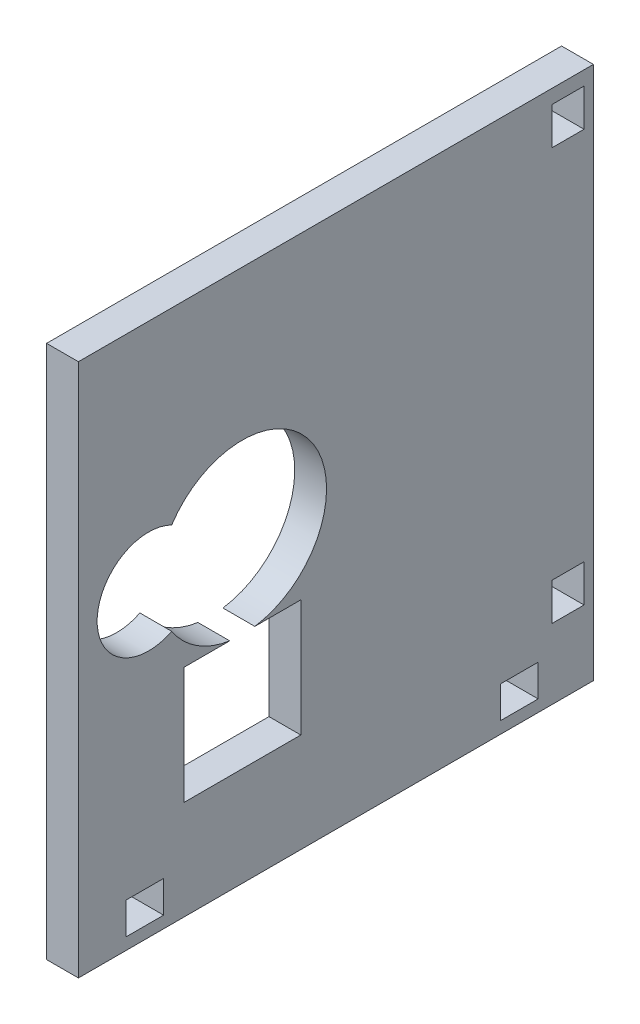
ISO-10303-21;
HEADER;
FILE_DESCRIPTION(('STEP AP214'),'2;1');
FILE_NAME('part.step','',(''),(''),'','','');
FILE_SCHEMA(('AUTOMOTIVE_DESIGN { 1 0 10303 214 1 1 1 1 }'));
ENDSEC;
DATA;
#1=APPLICATION_CONTEXT('core data for automotive mechanical design processes');
#2=APPLICATION_PROTOCOL_DEFINITION('international standard','automotive_design',2000,#1);
#3=PRODUCT_CONTEXT('',#1,'mechanical');
#4=PRODUCT('Part','Part','',(#3));
#5=PRODUCT_RELATED_PRODUCT_CATEGORY('part','',(#4));
#6=PRODUCT_DEFINITION_FORMATION('','',#4);
#7=PRODUCT_DEFINITION_CONTEXT('part definition',#1,'design');
#8=PRODUCT_DEFINITION('design','',#6,#7);
#9=PRODUCT_DEFINITION_SHAPE('','',#8);
#10=(LENGTH_UNIT() NAMED_UNIT(*) SI_UNIT(.MILLI.,.METRE.));
#11=(NAMED_UNIT(*) PLANE_ANGLE_UNIT() SI_UNIT($,.RADIAN.));
#12=(NAMED_UNIT(*) SI_UNIT($,.STERADIAN.) SOLID_ANGLE_UNIT());
#13=UNCERTAINTY_MEASURE_WITH_UNIT(LENGTH_MEASURE(1.E-05),#10,'distance_accuracy_value','');
#14=(GEOMETRIC_REPRESENTATION_CONTEXT(3) GLOBAL_UNCERTAINTY_ASSIGNED_CONTEXT((#13)) GLOBAL_UNIT_ASSIGNED_CONTEXT((#10,
#11,#12)) REPRESENTATION_CONTEXT('',''));
#15=CARTESIAN_POINT('',(0.,0.,0.));
#16=DIRECTION('',(0.,0.,1.));
#17=DIRECTION('',(1.,0.,0.));
#18=AXIS2_PLACEMENT_3D('',#15,#16,#17);
#19=CARTESIAN_POINT('',(1.7272,11.7348,-12.065));
#20=DIRECTION('',(0.,-1.,0.));
#21=DIRECTION('',(0.,0.,-1.));
#22=AXIS2_PLACEMENT_3D('',#19,#20,#21);
#23=PLANE('',#22);
#24=DIRECTION('',(1.,0.,0.));
#25=VECTOR('',#24,1.);
#26=CARTESIAN_POINT('',(-15.4139288385537,11.7348,-8.2103423214584));
#27=LINE('',#26,#25);
#28=CARTESIAN_POINT('',(0.,11.7348,-8.2103423214584));
#29=VERTEX_POINT('',#28);
#30=CARTESIAN_POINT('',(1.7272,11.7348,-8.2103423214584));
#31=VERTEX_POINT('',#30);
#32=EDGE_CURVE('E222',#29,#31,#27,.T.);
#33=ORIENTED_EDGE('',*,*,#32,.T.);
#34=DIRECTION('',(0.,0.,1.));
#35=VECTOR('',#34,1.);
#36=CARTESIAN_POINT('',(1.7272,11.7348,-12.065));
#37=LINE('',#36,#35);
#38=CARTESIAN_POINT('',(1.7272,11.7348,-5.715));
#39=VERTEX_POINT('',#38);
#40=EDGE_CURVE('E376',#31,#39,#37,.T.);
#41=ORIENTED_EDGE('',*,*,#40,.T.);
#42=DIRECTION('',(-1.,0.,0.));
#43=VECTOR('',#42,1.);
#44=CARTESIAN_POINT('',(1.7272,11.7348,-5.715));
#45=LINE('',#44,#43);
#46=CARTESIAN_POINT('',(0.,11.7348,-5.715));
#47=VERTEX_POINT('',#46);
#48=EDGE_CURVE('E401',#39,#47,#45,.T.);
#49=ORIENTED_EDGE('',*,*,#48,.T.);
#50=DIRECTION('',(0.,0.,1.));
#51=VECTOR('',#50,1.);
#52=CARTESIAN_POINT('',(0.,11.7348,-12.065));
#53=LINE('',#52,#51);
#54=EDGE_CURVE('E389',#29,#47,#53,.T.);
#55=ORIENTED_EDGE('',*,*,#54,.F.);
#56=EDGE_LOOP('',(#33,#41,#49,#55));
#57=FACE_BOUND('',#56,.T.);
#58=ADVANCED_FACE('F30',(#57),#23,.T.);
#59=CARTESIAN_POINT('',(1.7272,28.956,0.));
#60=DIRECTION('',(-1.,0.,0.));
#61=DIRECTION('',(0.,0.,1.));
#62=AXIS2_PLACEMENT_3D('',#59,#60,#61);
#63=PLANE('',#62);
#64=DIRECTION('',(0.,-1.,0.));
#65=VECTOR('',#64,1.);
#66=CARTESIAN_POINT('',(1.7272,2.36855,-22.9107999999998));
#67=LINE('',#66,#65);
#68=CARTESIAN_POINT('',(1.7272,2.36855,-22.9107999999998));
#69=VERTEX_POINT('',#68);
#70=CARTESIAN_POINT('',(1.7272,0.641349999999995,-22.9107999999998));
#71=VERTEX_POINT('',#70);
#72=EDGE_CURVE('E252',#69,#71,#67,.T.);
#73=ORIENTED_EDGE('',*,*,#72,.F.);
#74=DIRECTION('',(0.,0.,1.));
#75=VECTOR('',#74,1.);
#76=CARTESIAN_POINT('',(1.7272,2.36855,-24.9427999999998));
#77=LINE('',#76,#75);
#78=CARTESIAN_POINT('',(1.7272,2.36855,-24.9427999999998));
#79=VERTEX_POINT('',#78);
#80=EDGE_CURVE('E255',#79,#69,#77,.T.);
#81=ORIENTED_EDGE('',*,*,#80,.F.);
#82=DIRECTION('',(0.,1.,0.));
#83=VECTOR('',#82,1.);
#84=CARTESIAN_POINT('',(1.7272,0.641349999999995,-24.9427999999998));
#85=LINE('',#84,#83);
#86=CARTESIAN_POINT('',(1.7272,0.641349999999995,-24.9427999999998));
#87=VERTEX_POINT('',#86);
#88=EDGE_CURVE('E249',#87,#79,#85,.T.);
#89=ORIENTED_EDGE('',*,*,#88,.F.);
#90=DIRECTION('',(0.,0.,-1.));
#91=VECTOR('',#90,1.);
#92=CARTESIAN_POINT('',(1.7272,0.641349999999995,-22.9107999999998));
#93=LINE('',#92,#91);
#94=EDGE_CURVE('E53',#71,#87,#93,.T.);
#95=ORIENTED_EDGE('',*,*,#94,.F.);
#96=EDGE_LOOP('',(#73,#81,#89,#95));
#97=FACE_BOUND('',#96,.T.);
#98=DIRECTION('',(0.,-1.,0.));
#99=VECTOR('',#98,1.);
#100=CARTESIAN_POINT('',(1.7272,2.36854999999985,-2.59079999999976));
#101=LINE('',#100,#99);
#102=CARTESIAN_POINT('',(1.7272,2.36854999999985,-2.59079999999976));
#103=VERTEX_POINT('',#102);
#104=CARTESIAN_POINT('',(1.7272,0.641349999999853,-2.59079999999976));
#105=VERTEX_POINT('',#104);
#106=EDGE_CURVE('E283',#103,#105,#101,.T.);
#107=ORIENTED_EDGE('',*,*,#106,.F.);
#108=DIRECTION('',(0.,0.,1.));
#109=VECTOR('',#108,1.);
#110=CARTESIAN_POINT('',(1.7272,2.36854999999985,-4.62279999999976));
#111=LINE('',#110,#109);
#112=CARTESIAN_POINT('',(1.7272,2.36854999999985,-4.62279999999976));
#113=VERTEX_POINT('',#112);
#114=EDGE_CURVE('E286',#113,#103,#111,.T.);
#115=ORIENTED_EDGE('',*,*,#114,.F.);
#116=DIRECTION('',(0.,1.,0.));
#117=VECTOR('',#116,1.);
#118=CARTESIAN_POINT('',(1.7272,0.641349999999853,-4.62279999999976));
#119=LINE('',#118,#117);
#120=CARTESIAN_POINT('',(1.7272,0.641349999999853,-4.62279999999976));
#121=VERTEX_POINT('',#120);
#122=EDGE_CURVE('E279',#121,#113,#119,.T.);
#123=ORIENTED_EDGE('',*,*,#122,.F.);
#124=DIRECTION('',(0.,0.,-1.));
#125=VECTOR('',#124,1.);
#126=CARTESIAN_POINT('',(1.7272,0.641349999999853,-2.59079999999976));
#127=LINE('',#126,#125);
#128=EDGE_CURVE('E280',#105,#121,#127,.T.);
#129=ORIENTED_EDGE('',*,*,#128,.F.);
#130=EDGE_LOOP('',(#107,#115,#123,#129));
#131=FACE_BOUND('',#130,.T.);
#132=DIRECTION('',(0.,1.,1.19518349722811E-13));
#133=VECTOR('',#132,1.);
#134=CARTESIAN_POINT('',(1.7272,28.194,-27.4319999999998));
#135=LINE('',#134,#133);
#136=CARTESIAN_POINT('',(1.7272,26.162,-27.432));
#137=VERTEX_POINT('',#136);
#138=CARTESIAN_POINT('',(1.7272,28.194,-27.4319999999998));
#139=VERTEX_POINT('',#138);
#140=EDGE_CURVE('E343',#137,#139,#135,.T.);
#141=ORIENTED_EDGE('',*,*,#140,.F.);
#142=DIRECTION('',(0.,0.,-1.));
#143=VECTOR('',#142,1.);
#144=CARTESIAN_POINT('',(1.7272,26.162,-27.432));
#145=LINE('',#144,#143);
#146=CARTESIAN_POINT('',(1.7272,26.162,-25.7047999999998));
#147=VERTEX_POINT('',#146);
#148=EDGE_CURVE('E351',#147,#137,#145,.T.);
#149=ORIENTED_EDGE('',*,*,#148,.F.);
#150=DIRECTION('',(0.,-1.,0.));
#151=VECTOR('',#150,1.);
#152=CARTESIAN_POINT('',(1.7272,28.194,-25.7047999999998));
#153=LINE('',#152,#151);
#154=CARTESIAN_POINT('',(1.7272,28.194,-25.7047999999998));
#155=VERTEX_POINT('',#154);
#156=EDGE_CURVE('E348',#155,#147,#153,.T.);
#157=ORIENTED_EDGE('',*,*,#156,.F.);
#158=DIRECTION('',(0.,0.,1.));
#159=VECTOR('',#158,1.);
#160=CARTESIAN_POINT('',(1.7272,28.194,-27.4319999999998));
#161=LINE('',#160,#159);
#162=EDGE_CURVE('E345',#139,#155,#161,.T.);
#163=ORIENTED_EDGE('',*,*,#162,.F.);
#164=EDGE_LOOP('',(#141,#149,#157,#163));
#165=FACE_BOUND('',#164,.T.);
#166=DIRECTION('',(0.,-1.,0.));
#167=VECTOR('',#166,1.);
#168=CARTESIAN_POINT('',(1.7272,0.,0.));
#169=LINE('',#168,#167);
#170=CARTESIAN_POINT('',(1.7272,28.956,0.));
#171=VERTEX_POINT('',#170);
#172=CARTESIAN_POINT('',(1.7272,0.,0.));
#173=VERTEX_POINT('',#172);
#174=EDGE_CURVE('E408',#171,#173,#169,.T.);
#175=ORIENTED_EDGE('',*,*,#174,.T.);
#176=DIRECTION('',(0.,0.,-1.));
#177=VECTOR('',#176,1.);
#178=CARTESIAN_POINT('',(1.7272,0.,0.));
#179=LINE('',#178,#177);
#180=CARTESIAN_POINT('',(1.7272,0.,-27.94));
#181=VERTEX_POINT('',#180);
#182=EDGE_CURVE('E411',#173,#181,#179,.T.);
#183=ORIENTED_EDGE('',*,*,#182,.T.);
#184=DIRECTION('',(0.,1.,0.));
#185=VECTOR('',#184,1.);
#186=CARTESIAN_POINT('',(1.7272,0.,-27.94));
#187=LINE('',#186,#185);
#188=CARTESIAN_POINT('',(1.7272,28.956,-27.94));
#189=VERTEX_POINT('',#188);
#190=EDGE_CURVE('E414',#181,#189,#187,.T.);
#191=ORIENTED_EDGE('',*,*,#190,.T.);
#192=DIRECTION('',(0.,0.,1.));
#193=VECTOR('',#192,1.);
#194=CARTESIAN_POINT('',(1.7272,28.956,0.));
#195=LINE('',#194,#193);
#196=EDGE_CURVE('E416',#189,#171,#195,.T.);
#197=ORIENTED_EDGE('',*,*,#196,.T.);
#198=EDGE_LOOP('',(#175,#183,#191,#197));
#199=FACE_BOUND('',#198,.T.);
#200=ORIENTED_EDGE('',*,*,#40,.F.);
#201=CARTESIAN_POINT('',(1.7272,16.2559999999999,-8.89));
#202=DIRECTION('',(1.,0.,0.));
#203=DIRECTION('',(0.,0.,-1.));
#204=AXIS2_PLACEMENT_3D('',#201,#202,#203);
#205=CIRCLE('',#204,4.572);
#206=CARTESIAN_POINT('',(1.7272,13.7576885507407,-5.06095));
#207=VERTEX_POINT('',#206);
#208=EDGE_CURVE('E237',#207,#31,#205,.T.);
#209=ORIENTED_EDGE('',*,*,#208,.F.);
#210=CARTESIAN_POINT('',(1.7272,16.2559999999999,-3.81));
#211=DIRECTION('',(1.,0.,0.));
#212=DIRECTION('',(0.,0.,-1.));
#213=AXIS2_PLACEMENT_3D('',#210,#211,#212);
#214=CIRCLE('',#213,2.794);
#215=CARTESIAN_POINT('',(1.7272,18.7543114492592,-5.06095));
#216=VERTEX_POINT('',#215);
#217=EDGE_CURVE('E231',#216,#207,#214,.T.);
#218=ORIENTED_EDGE('',*,*,#217,.F.);
#219=CARTESIAN_POINT('',(1.7272,11.7348,-9.5696576785416));
#220=VERTEX_POINT('',#219);
#221=EDGE_CURVE('E240',#220,#216,#205,.T.);
#222=ORIENTED_EDGE('',*,*,#221,.F.);
#223=CARTESIAN_POINT('',(1.7272,11.7348,-12.065));
#224=VERTEX_POINT('',#223);
#225=EDGE_CURVE('E378',#224,#220,#37,.T.);
#226=ORIENTED_EDGE('',*,*,#225,.F.);
#227=DIRECTION('',(0.,1.,0.));
#228=VECTOR('',#227,1.);
#229=CARTESIAN_POINT('',(1.7272,5.3848,-12.065));
#230=LINE('',#229,#228);
#231=CARTESIAN_POINT('',(1.7272,5.3848,-12.065));
#232=VERTEX_POINT('',#231);
#233=EDGE_CURVE('E374',#232,#224,#230,.T.);
#234=ORIENTED_EDGE('',*,*,#233,.F.);
#235=DIRECTION('',(0.,0.,-1.));
#236=VECTOR('',#235,1.);
#237=CARTESIAN_POINT('',(1.7272,5.3848,-12.065));
#238=LINE('',#237,#236);
#239=CARTESIAN_POINT('',(1.7272,5.3848,-5.715));
#240=VERTEX_POINT('',#239);
#241=EDGE_CURVE('E384',#240,#232,#238,.T.);
#242=ORIENTED_EDGE('',*,*,#241,.F.);
#243=DIRECTION('',(0.,-1.,0.));
#244=VECTOR('',#243,1.);
#245=CARTESIAN_POINT('',(1.7272,5.3848,-5.715));
#246=LINE('',#245,#244);
#247=EDGE_CURVE('E381',#39,#240,#246,.T.);
#248=ORIENTED_EDGE('',*,*,#247,.F.);
#249=EDGE_LOOP('',(#200,#209,#218,#222,#226,#234,#242,#248));
#250=FACE_BOUND('',#249,.T.);
#251=DIRECTION('',(0.,1.,1.17810944726771E-13));
#252=VECTOR('',#251,1.);
#253=CARTESIAN_POINT('',(1.7272,5.842,-27.432));
#254=LINE('',#253,#252);
#255=CARTESIAN_POINT('',(1.7272,3.80999999999999,-27.4320000000002));
#256=VERTEX_POINT('',#255);
#257=CARTESIAN_POINT('',(1.7272,5.842,-27.432));
#258=VERTEX_POINT('',#257);
#259=EDGE_CURVE('E312',#256,#258,#254,.T.);
#260=ORIENTED_EDGE('',*,*,#259,.F.);
#261=DIRECTION('',(0.,0.,-1.));
#262=VECTOR('',#261,1.);
#263=CARTESIAN_POINT('',(1.7272,3.80999999999999,-27.4320000000002));
#264=LINE('',#263,#262);
#265=CARTESIAN_POINT('',(1.7272,3.80999999999999,-25.7048));
#266=VERTEX_POINT('',#265);
#267=EDGE_CURVE('E320',#266,#256,#264,.T.);
#268=ORIENTED_EDGE('',*,*,#267,.F.);
#269=DIRECTION('',(0.,-1.,0.));
#270=VECTOR('',#269,1.);
#271=CARTESIAN_POINT('',(1.7272,5.84199999999999,-25.7048));
#272=LINE('',#271,#270);
#273=CARTESIAN_POINT('',(1.7272,5.84199999999999,-25.7048));
#274=VERTEX_POINT('',#273);
#275=EDGE_CURVE('E317',#274,#266,#272,.T.);
#276=ORIENTED_EDGE('',*,*,#275,.F.);
#277=DIRECTION('',(0.,0.,1.));
#278=VECTOR('',#277,1.);
#279=CARTESIAN_POINT('',(1.7272,5.842,-27.432));
#280=LINE('',#279,#278);
#281=EDGE_CURVE('E314',#258,#274,#280,.T.);
#282=ORIENTED_EDGE('',*,*,#281,.F.);
#283=EDGE_LOOP('',(#260,#268,#276,#282));
#284=FACE_BOUND('',#283,.T.);
#285=ADVANCED_FACE('F450',(#97,#131,#165,#199,#250,#284),#63,.F.);
#286=CARTESIAN_POINT('',(0.,28.956,0.));
#287=DIRECTION('',(-1.,0.,0.));
#288=DIRECTION('',(0.,0.,1.));
#289=AXIS2_PLACEMENT_3D('',#286,#287,#288);
#290=PLANE('',#289);
#291=CARTESIAN_POINT('',(0.,16.2559999999999,-8.89));
#292=DIRECTION('',(-1.,0.,0.));
#293=DIRECTION('',(0.,0.,1.));
#294=AXIS2_PLACEMENT_3D('',#291,#292,#293);
#295=CIRCLE('',#294,4.572);
#296=CARTESIAN_POINT('',(0.,13.7576885507407,-5.06095));
#297=VERTEX_POINT('',#296);
#298=EDGE_CURVE('E216',#297,#29,#295,.F.);
#299=ORIENTED_EDGE('',*,*,#298,.T.);
#300=ORIENTED_EDGE('',*,*,#54,.T.);
#301=DIRECTION('',(0.,-1.,0.));
#302=VECTOR('',#301,1.);
#303=CARTESIAN_POINT('',(0.,5.3848,-5.715));
#304=LINE('',#303,#302);
#305=CARTESIAN_POINT('',(0.,5.3848,-5.715));
#306=VERTEX_POINT('',#305);
#307=EDGE_CURVE('E392',#47,#306,#304,.T.);
#308=ORIENTED_EDGE('',*,*,#307,.T.);
#309=DIRECTION('',(0.,0.,-1.));
#310=VECTOR('',#309,1.);
#311=CARTESIAN_POINT('',(0.,5.3848,-12.065));
#312=LINE('',#311,#310);
#313=CARTESIAN_POINT('',(0.,5.3848,-12.065));
#314=VERTEX_POINT('',#313);
#315=EDGE_CURVE('E377',#306,#314,#312,.T.);
#316=ORIENTED_EDGE('',*,*,#315,.T.);
#317=DIRECTION('',(0.,1.,0.));
#318=VECTOR('',#317,1.);
#319=CARTESIAN_POINT('',(0.,5.3848,-12.065));
#320=LINE('',#319,#318);
#321=CARTESIAN_POINT('',(0.,11.7348,-12.065));
#322=VERTEX_POINT('',#321);
#323=EDGE_CURVE('E373',#314,#322,#320,.T.);
#324=ORIENTED_EDGE('',*,*,#323,.T.);
#325=CARTESIAN_POINT('',(0.,11.7348,-9.5696576785416));
#326=VERTEX_POINT('',#325);
#327=EDGE_CURVE('E390',#322,#326,#53,.T.);
#328=ORIENTED_EDGE('',*,*,#327,.T.);
#329=CARTESIAN_POINT('',(0.,16.2559999999999,-8.89));
#330=DIRECTION('',(-1.,0.,0.));
#331=DIRECTION('',(0.,0.,1.));
#332=AXIS2_PLACEMENT_3D('',#329,#330,#331);
#333=CIRCLE('',#332,4.572);
#334=CARTESIAN_POINT('',(0.,18.7543114492592,-5.06095));
#335=VERTEX_POINT('',#334);
#336=EDGE_CURVE('E45',#326,#335,#333,.F.);
#337=ORIENTED_EDGE('',*,*,#336,.T.);
#338=CARTESIAN_POINT('',(0.,16.2559999999999,-3.81));
#339=DIRECTION('',(-1.,0.,0.));
#340=DIRECTION('',(0.,0.,1.));
#341=AXIS2_PLACEMENT_3D('',#338,#339,#340);
#342=CIRCLE('',#341,2.794);
#343=EDGE_CURVE('E229',#335,#297,#342,.F.);
#344=ORIENTED_EDGE('',*,*,#343,.T.);
#345=EDGE_LOOP('',(#299,#300,#308,#316,#324,#328,#337,#344));
#346=FACE_BOUND('',#345,.T.);
#347=DIRECTION('',(0.,0.,1.));
#348=VECTOR('',#347,1.);
#349=CARTESIAN_POINT('',(0.,2.36855,-24.9427999999998));
#350=LINE('',#349,#348);
#351=CARTESIAN_POINT('',(0.,2.36854999999999,-24.9427999999998));
#352=VERTEX_POINT('',#351);
#353=CARTESIAN_POINT('',(0.,2.36855,-22.9107999999998));
#354=VERTEX_POINT('',#353);
#355=EDGE_CURVE('E251',#352,#354,#350,.T.);
#356=ORIENTED_EDGE('',*,*,#355,.T.);
#357=DIRECTION('',(0.,-1.,0.));
#358=VECTOR('',#357,1.);
#359=CARTESIAN_POINT('',(0.,2.36855,-22.9107999999998));
#360=LINE('',#359,#358);
#361=CARTESIAN_POINT('',(0.,0.641349999999995,-22.9107999999998));
#362=VERTEX_POINT('',#361);
#363=EDGE_CURVE('E272',#354,#362,#360,.T.);
#364=ORIENTED_EDGE('',*,*,#363,.T.);
#365=DIRECTION('',(0.,0.,-1.));
#366=VECTOR('',#365,1.);
#367=CARTESIAN_POINT('',(0.,0.641349999999995,-22.9107999999998));
#368=LINE('',#367,#366);
#369=CARTESIAN_POINT('',(0.,0.641349999999995,-24.9427999999998));
#370=VERTEX_POINT('',#369);
#371=EDGE_CURVE('E268',#362,#370,#368,.T.);
#372=ORIENTED_EDGE('',*,*,#371,.T.);
#373=DIRECTION('',(0.,1.,0.));
#374=VECTOR('',#373,1.);
#375=CARTESIAN_POINT('',(0.,0.641349999999995,-24.9427999999998));
#376=LINE('',#375,#374);
#377=EDGE_CURVE('E263',#370,#352,#376,.T.);
#378=ORIENTED_EDGE('',*,*,#377,.T.);
#379=EDGE_LOOP('',(#356,#364,#372,#378));
#380=FACE_BOUND('',#379,.T.);
#381=DIRECTION('',(0.,0.,1.));
#382=VECTOR('',#381,1.);
#383=CARTESIAN_POINT('',(0.,2.36854999999985,-4.62279999999976));
#384=LINE('',#383,#382);
#385=CARTESIAN_POINT('',(0.,2.36854999999985,-4.62279999999976));
#386=VERTEX_POINT('',#385);
#387=CARTESIAN_POINT('',(0.,2.36854999999985,-2.59079999999976));
#388=VERTEX_POINT('',#387);
#389=EDGE_CURVE('E282',#386,#388,#384,.T.);
#390=ORIENTED_EDGE('',*,*,#389,.T.);
#391=DIRECTION('',(0.,-1.,0.));
#392=VECTOR('',#391,1.);
#393=CARTESIAN_POINT('',(0.,2.36854999999985,-2.59079999999976));
#394=LINE('',#393,#392);
#395=CARTESIAN_POINT('',(0.,0.641349999999853,-2.59079999999976));
#396=VERTEX_POINT('',#395);
#397=EDGE_CURVE('E303',#388,#396,#394,.T.);
#398=ORIENTED_EDGE('',*,*,#397,.T.);
#399=DIRECTION('',(0.,0.,-1.));
#400=VECTOR('',#399,1.);
#401=CARTESIAN_POINT('',(0.,0.641349999999853,-2.59079999999976));
#402=LINE('',#401,#400);
#403=CARTESIAN_POINT('',(0.,0.641349999999853,-4.62279999999976));
#404=VERTEX_POINT('',#403);
#405=EDGE_CURVE('E299',#396,#404,#402,.T.);
#406=ORIENTED_EDGE('',*,*,#405,.T.);
#407=DIRECTION('',(0.,1.,0.));
#408=VECTOR('',#407,1.);
#409=CARTESIAN_POINT('',(0.,0.641349999999853,-4.62279999999976));
#410=LINE('',#409,#408);
#411=EDGE_CURVE('E294',#404,#386,#410,.T.);
#412=ORIENTED_EDGE('',*,*,#411,.T.);
#413=EDGE_LOOP('',(#390,#398,#406,#412));
#414=FACE_BOUND('',#413,.T.);
#415=DIRECTION('',(0.,0.,-1.));
#416=VECTOR('',#415,1.);
#417=CARTESIAN_POINT('',(0.,26.162,-27.432));
#418=LINE('',#417,#416);
#419=CARTESIAN_POINT('',(0.,26.162,-25.7047999999998));
#420=VERTEX_POINT('',#419);
#421=CARTESIAN_POINT('',(0.,26.162,-27.432));
#422=VERTEX_POINT('',#421);
#423=EDGE_CURVE('E346',#420,#422,#418,.T.);
#424=ORIENTED_EDGE('',*,*,#423,.T.);
#425=DIRECTION('',(0.,1.,1.19518349722811E-13));
#426=VECTOR('',#425,1.);
#427=CARTESIAN_POINT('',(0.,28.194,-27.4319999999998));
#428=LINE('',#427,#426);
#429=CARTESIAN_POINT('',(0.,28.194,-27.4319999999998));
#430=VERTEX_POINT('',#429);
#431=EDGE_CURVE('E342',#422,#430,#428,.T.);
#432=ORIENTED_EDGE('',*,*,#431,.T.);
#433=DIRECTION('',(0.,0.,1.));
#434=VECTOR('',#433,1.);
#435=CARTESIAN_POINT('',(0.,28.194,-27.4319999999998));
#436=LINE('',#435,#434);
#437=CARTESIAN_POINT('',(0.,28.194,-25.7047999999998));
#438=VERTEX_POINT('',#437);
#439=EDGE_CURVE('E356',#430,#438,#436,.T.);
#440=ORIENTED_EDGE('',*,*,#439,.T.);
#441=DIRECTION('',(0.,-1.,0.));
#442=VECTOR('',#441,1.);
#443=CARTESIAN_POINT('',(0.,28.194,-25.7047999999998));
#444=LINE('',#443,#442);
#445=EDGE_CURVE('E359',#438,#420,#444,.T.);
#446=ORIENTED_EDGE('',*,*,#445,.T.);
#447=EDGE_LOOP('',(#424,#432,#440,#446));
#448=FACE_BOUND('',#447,.T.);
#449=DIRECTION('',(0.,-1.,0.));
#450=VECTOR('',#449,1.);
#451=CARTESIAN_POINT('',(0.,0.,0.));
#452=LINE('',#451,#450);
#453=CARTESIAN_POINT('',(0.,28.956,0.));
#454=VERTEX_POINT('',#453);
#455=CARTESIAN_POINT('',(0.,0.,0.));
#456=VERTEX_POINT('',#455);
#457=EDGE_CURVE('E407',#454,#456,#452,.T.);
#458=ORIENTED_EDGE('',*,*,#457,.F.);
#459=DIRECTION('',(0.,0.,1.));
#460=VECTOR('',#459,1.);
#461=CARTESIAN_POINT('',(0.,28.956,0.));
#462=LINE('',#461,#460);
#463=CARTESIAN_POINT('',(0.,28.956,-27.94));
#464=VERTEX_POINT('',#463);
#465=EDGE_CURVE('E412',#464,#454,#462,.T.);
#466=ORIENTED_EDGE('',*,*,#465,.F.);
#467=DIRECTION('',(0.,1.,0.));
#468=VECTOR('',#467,1.);
#469=CARTESIAN_POINT('',(0.,0.,-27.94));
#470=LINE('',#469,#468);
#471=CARTESIAN_POINT('',(0.,0.,-27.94));
#472=VERTEX_POINT('',#471);
#473=EDGE_CURVE('E423',#472,#464,#470,.T.);
#474=ORIENTED_EDGE('',*,*,#473,.F.);
#475=DIRECTION('',(0.,0.,-1.));
#476=VECTOR('',#475,1.);
#477=CARTESIAN_POINT('',(0.,0.,0.));
#478=LINE('',#477,#476);
#479=EDGE_CURVE('E421',#456,#472,#478,.T.);
#480=ORIENTED_EDGE('',*,*,#479,.F.);
#481=EDGE_LOOP('',(#458,#466,#474,#480));
#482=FACE_BOUND('',#481,.T.);
#483=DIRECTION('',(0.,0.,-1.));
#484=VECTOR('',#483,1.);
#485=CARTESIAN_POINT('',(0.,3.80999999999999,-27.4320000000002));
#486=LINE('',#485,#484);
#487=CARTESIAN_POINT('',(0.,3.80999999999999,-25.7048));
#488=VERTEX_POINT('',#487);
#489=CARTESIAN_POINT('',(0.,3.80999999999999,-27.4320000000002));
#490=VERTEX_POINT('',#489);
#491=EDGE_CURVE('E315',#488,#490,#486,.T.);
#492=ORIENTED_EDGE('',*,*,#491,.T.);
#493=DIRECTION('',(0.,1.,1.17810944726771E-13));
#494=VECTOR('',#493,1.);
#495=CARTESIAN_POINT('',(0.,5.842,-27.432));
#496=LINE('',#495,#494);
#497=CARTESIAN_POINT('',(0.,5.842,-27.432));
#498=VERTEX_POINT('',#497);
#499=EDGE_CURVE('E311',#490,#498,#496,.T.);
#500=ORIENTED_EDGE('',*,*,#499,.T.);
#501=DIRECTION('',(0.,0.,1.));
#502=VECTOR('',#501,1.);
#503=CARTESIAN_POINT('',(0.,5.842,-27.432));
#504=LINE('',#503,#502);
#505=CARTESIAN_POINT('',(0.,5.84199999999999,-25.7048));
#506=VERTEX_POINT('',#505);
#507=EDGE_CURVE('E325',#498,#506,#504,.T.);
#508=ORIENTED_EDGE('',*,*,#507,.T.);
#509=DIRECTION('',(0.,-1.,0.));
#510=VECTOR('',#509,1.);
#511=CARTESIAN_POINT('',(0.,5.84199999999999,-25.7048));
#512=LINE('',#511,#510);
#513=EDGE_CURVE('E328',#506,#488,#512,.T.);
#514=ORIENTED_EDGE('',*,*,#513,.T.);
#515=EDGE_LOOP('',(#492,#500,#508,#514));
#516=FACE_BOUND('',#515,.T.);
#517=ADVANCED_FACE('F234',(#346,#380,#414,#448,#482,#516),#290,.T.);
#518=CARTESIAN_POINT('',(1.7272,0.,0.));
#519=DIRECTION('',(0.,0.,-1.));
#520=DIRECTION('',(-1.,0.,0.));
#521=AXIS2_PLACEMENT_3D('',#518,#519,#520);
#522=PLANE('',#521);
#523=ORIENTED_EDGE('',*,*,#457,.T.);
#524=DIRECTION('',(-1.,0.,0.));
#525=VECTOR('',#524,1.);
#526=CARTESIAN_POINT('',(1.7272,0.,0.));
#527=LINE('',#526,#525);
#528=EDGE_CURVE('E11',#173,#456,#527,.T.);
#529=ORIENTED_EDGE('',*,*,#528,.F.);
#530=ORIENTED_EDGE('',*,*,#174,.F.);
#531=DIRECTION('',(-1.,0.,0.));
#532=VECTOR('',#531,1.);
#533=CARTESIAN_POINT('',(1.7272,28.956,0.));
#534=LINE('',#533,#532);
#535=EDGE_CURVE('E418',#171,#454,#534,.T.);
#536=ORIENTED_EDGE('',*,*,#535,.T.);
#537=EDGE_LOOP('',(#523,#529,#530,#536));
#538=FACE_BOUND('',#537,.T.);
#539=ADVANCED_FACE('F32',(#538),#522,.F.);
#540=CARTESIAN_POINT('',(1.7272,0.,0.));
#541=DIRECTION('',(0.,1.,0.));
#542=DIRECTION('',(0.,0.,1.));
#543=AXIS2_PLACEMENT_3D('',#540,#541,#542);
#544=PLANE('',#543);
#545=ORIENTED_EDGE('',*,*,#479,.T.);
#546=DIRECTION('',(-1.,0.,0.));
#547=VECTOR('',#546,1.);
#548=CARTESIAN_POINT('',(1.7272,0.,-27.94));
#549=LINE('',#548,#547);
#550=EDGE_CURVE('E38',#181,#472,#549,.T.);
#551=ORIENTED_EDGE('',*,*,#550,.F.);
#552=ORIENTED_EDGE('',*,*,#182,.F.);
#553=ORIENTED_EDGE('',*,*,#528,.T.);
#554=EDGE_LOOP('',(#545,#551,#552,#553));
#555=FACE_BOUND('',#554,.T.);
#556=ADVANCED_FACE('F452',(#555),#544,.F.);
#557=CARTESIAN_POINT('',(1.7272,0.,-27.94));
#558=DIRECTION('',(0.,0.,1.));
#559=DIRECTION('',(1.,0.,0.));
#560=AXIS2_PLACEMENT_3D('',#557,#558,#559);
#561=PLANE('',#560);
#562=ORIENTED_EDGE('',*,*,#473,.T.);
#563=DIRECTION('',(-1.,0.,0.));
#564=VECTOR('',#563,1.);
#565=CARTESIAN_POINT('',(1.7272,28.956,-27.94));
#566=LINE('',#565,#564);
#567=EDGE_CURVE('E428',#189,#464,#566,.T.);
#568=ORIENTED_EDGE('',*,*,#567,.F.);
#569=ORIENTED_EDGE('',*,*,#190,.F.);
#570=ORIENTED_EDGE('',*,*,#550,.T.);
#571=EDGE_LOOP('',(#562,#568,#569,#570));
#572=FACE_BOUND('',#571,.T.);
#573=ADVANCED_FACE('F435',(#572),#561,.F.);
#574=CARTESIAN_POINT('',(1.7272,28.956,0.));
#575=DIRECTION('',(0.,-1.,0.));
#576=DIRECTION('',(0.,0.,-1.));
#577=AXIS2_PLACEMENT_3D('',#574,#575,#576);
#578=PLANE('',#577);
#579=ORIENTED_EDGE('',*,*,#465,.T.);
#580=ORIENTED_EDGE('',*,*,#535,.F.);
#581=ORIENTED_EDGE('',*,*,#196,.F.);
#582=ORIENTED_EDGE('',*,*,#567,.T.);
#583=EDGE_LOOP('',(#579,#580,#581,#582));
#584=FACE_BOUND('',#583,.T.);
#585=ADVANCED_FACE('F444',(#584),#578,.F.);
#586=CARTESIAN_POINT('',(1.7272,5.3848,-12.065));
#587=DIRECTION('',(0.,0.,1.));
#588=DIRECTION('',(1.,0.,0.));
#589=AXIS2_PLACEMENT_3D('',#586,#587,#588);
#590=PLANE('',#589);
#591=ORIENTED_EDGE('',*,*,#323,.F.);
#592=DIRECTION('',(-1.,0.,0.));
#593=VECTOR('',#592,1.);
#594=CARTESIAN_POINT('',(1.7272,5.3848,-12.065));
#595=LINE('',#594,#593);
#596=EDGE_CURVE('E386',#232,#314,#595,.T.);
#597=ORIENTED_EDGE('',*,*,#596,.F.);
#598=ORIENTED_EDGE('',*,*,#233,.T.);
#599=DIRECTION('',(-1.,0.,0.));
#600=VECTOR('',#599,1.);
#601=CARTESIAN_POINT('',(1.7272,11.7348,-12.065));
#602=LINE('',#601,#600);
#603=EDGE_CURVE('E404',#224,#322,#602,.T.);
#604=ORIENTED_EDGE('',*,*,#603,.T.);
#605=EDGE_LOOP('',(#591,#597,#598,#604));
#606=FACE_BOUND('',#605,.T.);
#607=ADVANCED_FACE('F472',(#606),#590,.T.);
#608=DIRECTION('',(1.,0.,0.));
#609=VECTOR('',#608,1.);
#610=CARTESIAN_POINT('',(-15.4139288385537,11.7348,-9.5696576785416));
#611=LINE('',#610,#609);
#612=EDGE_CURVE('E244',#326,#220,#611,.T.);
#613=ORIENTED_EDGE('',*,*,#612,.F.);
#614=ORIENTED_EDGE('',*,*,#327,.F.);
#615=ORIENTED_EDGE('',*,*,#603,.F.);
#616=ORIENTED_EDGE('',*,*,#225,.T.);
#617=EDGE_LOOP('',(#613,#614,#615,#616));
#618=FACE_BOUND('',#617,.T.);
#619=ADVANCED_FACE('F462',(#618),#23,.T.);
#620=CARTESIAN_POINT('',(1.7272,5.3848,-5.715));
#621=DIRECTION('',(0.,0.,-1.));
#622=DIRECTION('',(-1.,0.,0.));
#623=AXIS2_PLACEMENT_3D('',#620,#621,#622);
#624=PLANE('',#623);
#625=ORIENTED_EDGE('',*,*,#307,.F.);
#626=ORIENTED_EDGE('',*,*,#48,.F.);
#627=ORIENTED_EDGE('',*,*,#247,.T.);
#628=DIRECTION('',(-1.,0.,0.));
#629=VECTOR('',#628,1.);
#630=CARTESIAN_POINT('',(1.7272,5.3848,-5.715));
#631=LINE('',#630,#629);
#632=EDGE_CURVE('E399',#240,#306,#631,.T.);
#633=ORIENTED_EDGE('',*,*,#632,.T.);
#634=EDGE_LOOP('',(#625,#626,#627,#633));
#635=FACE_BOUND('',#634,.T.);
#636=ADVANCED_FACE('F471',(#635),#624,.T.);
#637=CARTESIAN_POINT('',(1.7272,5.3848,-12.065));
#638=DIRECTION('',(0.,1.,0.));
#639=DIRECTION('',(0.,0.,1.));
#640=AXIS2_PLACEMENT_3D('',#637,#638,#639);
#641=PLANE('',#640);
#642=ORIENTED_EDGE('',*,*,#315,.F.);
#643=ORIENTED_EDGE('',*,*,#632,.F.);
#644=ORIENTED_EDGE('',*,*,#241,.T.);
#645=ORIENTED_EDGE('',*,*,#596,.T.);
#646=EDGE_LOOP('',(#642,#643,#644,#645));
#647=FACE_BOUND('',#646,.T.);
#648=ADVANCED_FACE('F478',(#647),#641,.T.);
#649=CARTESIAN_POINT('',(1.7272,28.194,-27.4319999999998));
#650=DIRECTION('',(0.,-1.19518349722811E-13,1.));
#651=DIRECTION('',(0.,-1.,-1.19518349722811E-13));
#652=AXIS2_PLACEMENT_3D('',#649,#650,#651);
#653=PLANE('',#652);
#654=ORIENTED_EDGE('',*,*,#431,.F.);
#655=DIRECTION('',(-1.,0.,0.));
#656=VECTOR('',#655,1.);
#657=CARTESIAN_POINT('',(1.7272,26.162,-27.432));
#658=LINE('',#657,#656);
#659=EDGE_CURVE('E353',#137,#422,#658,.T.);
#660=ORIENTED_EDGE('',*,*,#659,.F.);
#661=ORIENTED_EDGE('',*,*,#140,.T.);
#662=DIRECTION('',(-1.,0.,0.));
#663=VECTOR('',#662,1.);
#664=CARTESIAN_POINT('',(1.7272,28.194,-27.4319999999998));
#665=LINE('',#664,#663);
#666=EDGE_CURVE('E370',#139,#430,#665,.T.);
#667=ORIENTED_EDGE('',*,*,#666,.T.);
#668=EDGE_LOOP('',(#654,#660,#661,#667));
#669=FACE_BOUND('',#668,.T.);
#670=ADVANCED_FACE('F560',(#669),#653,.T.);
#671=CARTESIAN_POINT('',(1.7272,28.194,-27.4319999999998));
#672=DIRECTION('',(0.,-1.,0.));
#673=DIRECTION('',(0.,0.,-1.));
#674=AXIS2_PLACEMENT_3D('',#671,#672,#673);
#675=PLANE('',#674);
#676=ORIENTED_EDGE('',*,*,#439,.F.);
#677=ORIENTED_EDGE('',*,*,#666,.F.);
#678=ORIENTED_EDGE('',*,*,#162,.T.);
#679=DIRECTION('',(-1.,0.,0.));
#680=VECTOR('',#679,1.);
#681=CARTESIAN_POINT('',(1.7272,28.194,-25.7047999999998));
#682=LINE('',#681,#680);
#683=EDGE_CURVE('E368',#155,#438,#682,.T.);
#684=ORIENTED_EDGE('',*,*,#683,.T.);
#685=EDGE_LOOP('',(#676,#677,#678,#684));
#686=FACE_BOUND('',#685,.T.);
#687=ADVANCED_FACE('F556',(#686),#675,.T.);
#688=CARTESIAN_POINT('',(1.7272,28.194,-25.7047999999998));
#689=DIRECTION('',(0.,0.,-1.));
#690=DIRECTION('',(-1.,0.,0.));
#691=AXIS2_PLACEMENT_3D('',#688,#689,#690);
#692=PLANE('',#691);
#693=ORIENTED_EDGE('',*,*,#445,.F.);
#694=ORIENTED_EDGE('',*,*,#683,.F.);
#695=ORIENTED_EDGE('',*,*,#156,.T.);
#696=DIRECTION('',(-1.,0.,0.));
#697=VECTOR('',#696,1.);
#698=CARTESIAN_POINT('',(1.7272,26.162,-25.7047999999998));
#699=LINE('',#698,#697);
#700=EDGE_CURVE('E366',#147,#420,#699,.T.);
#701=ORIENTED_EDGE('',*,*,#700,.T.);
#702=EDGE_LOOP('',(#693,#694,#695,#701));
#703=FACE_BOUND('',#702,.T.);
#704=ADVANCED_FACE('F552',(#703),#692,.T.);
#705=CARTESIAN_POINT('',(1.7272,26.162,-27.432));
#706=DIRECTION('',(0.,1.,0.));
#707=DIRECTION('',(0.,0.,1.));
#708=AXIS2_PLACEMENT_3D('',#705,#706,#707);
#709=PLANE('',#708);
#710=ORIENTED_EDGE('',*,*,#423,.F.);
#711=ORIENTED_EDGE('',*,*,#700,.F.);
#712=ORIENTED_EDGE('',*,*,#148,.T.);
#713=ORIENTED_EDGE('',*,*,#659,.T.);
#714=EDGE_LOOP('',(#710,#711,#712,#713));
#715=FACE_BOUND('',#714,.T.);
#716=ADVANCED_FACE('F548',(#715),#709,.T.);
#717=CARTESIAN_POINT('',(1.7272,5.842,-27.432));
#718=DIRECTION('',(0.,-1.17810944726771E-13,1.));
#719=DIRECTION('',(0.,-1.,-1.17810944726771E-13));
#720=AXIS2_PLACEMENT_3D('',#717,#718,#719);
#721=PLANE('',#720);
#722=ORIENTED_EDGE('',*,*,#499,.F.);
#723=DIRECTION('',(-1.,0.,0.));
#724=VECTOR('',#723,1.);
#725=CARTESIAN_POINT('',(1.7272,3.80999999999999,-27.4320000000002));
#726=LINE('',#725,#724);
#727=EDGE_CURVE('E322',#256,#490,#726,.T.);
#728=ORIENTED_EDGE('',*,*,#727,.F.);
#729=ORIENTED_EDGE('',*,*,#259,.T.);
#730=DIRECTION('',(-1.,0.,0.));
#731=VECTOR('',#730,1.);
#732=CARTESIAN_POINT('',(1.7272,5.842,-27.432));
#733=LINE('',#732,#731);
#734=EDGE_CURVE('E339',#258,#498,#733,.T.);
#735=ORIENTED_EDGE('',*,*,#734,.T.);
#736=EDGE_LOOP('',(#722,#728,#729,#735));
#737=FACE_BOUND('',#736,.T.);
#738=ADVANCED_FACE('F544',(#737),#721,.T.);
#739=CARTESIAN_POINT('',(1.7272,5.842,-27.432));
#740=DIRECTION('',(0.,-1.,0.));
#741=DIRECTION('',(0.,0.,-1.));
#742=AXIS2_PLACEMENT_3D('',#739,#740,#741);
#743=PLANE('',#742);
#744=ORIENTED_EDGE('',*,*,#507,.F.);
#745=ORIENTED_EDGE('',*,*,#734,.F.);
#746=ORIENTED_EDGE('',*,*,#281,.T.);
#747=DIRECTION('',(-1.,0.,0.));
#748=VECTOR('',#747,1.);
#749=CARTESIAN_POINT('',(1.7272,5.84199999999999,-25.7048));
#750=LINE('',#749,#748);
#751=EDGE_CURVE('E337',#274,#506,#750,.T.);
#752=ORIENTED_EDGE('',*,*,#751,.T.);
#753=EDGE_LOOP('',(#744,#745,#746,#752));
#754=FACE_BOUND('',#753,.T.);
#755=ADVANCED_FACE('F540',(#754),#743,.T.);
#756=CARTESIAN_POINT('',(1.7272,5.84199999999999,-25.7048));
#757=DIRECTION('',(0.,0.,-1.));
#758=DIRECTION('',(-1.,0.,0.));
#759=AXIS2_PLACEMENT_3D('',#756,#757,#758);
#760=PLANE('',#759);
#761=ORIENTED_EDGE('',*,*,#513,.F.);
#762=ORIENTED_EDGE('',*,*,#751,.F.);
#763=ORIENTED_EDGE('',*,*,#275,.T.);
#764=DIRECTION('',(-1.,0.,0.));
#765=VECTOR('',#764,1.);
#766=CARTESIAN_POINT('',(1.7272,3.80999999999999,-25.7048));
#767=LINE('',#766,#765);
#768=EDGE_CURVE('E335',#266,#488,#767,.T.);
#769=ORIENTED_EDGE('',*,*,#768,.T.);
#770=EDGE_LOOP('',(#761,#762,#763,#769));
#771=FACE_BOUND('',#770,.T.);
#772=ADVANCED_FACE('F536',(#771),#760,.T.);
#773=CARTESIAN_POINT('',(1.7272,3.80999999999999,-27.4320000000002));
#774=DIRECTION('',(0.,1.,0.));
#775=DIRECTION('',(0.,0.,1.));
#776=AXIS2_PLACEMENT_3D('',#773,#774,#775);
#777=PLANE('',#776);
#778=ORIENTED_EDGE('',*,*,#491,.F.);
#779=ORIENTED_EDGE('',*,*,#768,.F.);
#780=ORIENTED_EDGE('',*,*,#267,.T.);
#781=ORIENTED_EDGE('',*,*,#727,.T.);
#782=EDGE_LOOP('',(#778,#779,#780,#781));
#783=FACE_BOUND('',#782,.T.);
#784=ADVANCED_FACE('F532',(#783),#777,.T.);
#785=CARTESIAN_POINT('',(-2.66687904487624,2.36854999999985,-4.62279999999976));
#786=DIRECTION('',(0.,1.,0.));
#787=DIRECTION('',(0.,0.,1.));
#788=AXIS2_PLACEMENT_3D('',#785,#786,#787);
#789=PLANE('',#788);
#790=DIRECTION('',(1.,0.,0.));
#791=VECTOR('',#790,1.);
#792=CARTESIAN_POINT('',(-2.66687904487624,2.36854999999985,-4.62279999999976));
#793=LINE('',#792,#791);
#794=EDGE_CURVE('E297',#386,#113,#793,.T.);
#795=ORIENTED_EDGE('',*,*,#794,.T.);
#796=ORIENTED_EDGE('',*,*,#114,.T.);
#797=DIRECTION('',(1.,0.,0.));
#798=VECTOR('',#797,1.);
#799=CARTESIAN_POINT('',(-2.66687904487624,2.36854999999985,-2.59079999999976));
#800=LINE('',#799,#798);
#801=EDGE_CURVE('E293',#388,#103,#800,.T.);
#802=ORIENTED_EDGE('',*,*,#801,.F.);
#803=ORIENTED_EDGE('',*,*,#389,.F.);
#804=EDGE_LOOP('',(#795,#796,#802,#803));
#805=FACE_BOUND('',#804,.T.);
#806=ADVANCED_FACE('F528',(#805),#789,.F.);
#807=CARTESIAN_POINT('',(-2.66687904487624,2.36854999999985,-2.59079999999976));
#808=DIRECTION('',(0.,0.,1.));
#809=DIRECTION('',(1.,0.,0.));
#810=AXIS2_PLACEMENT_3D('',#807,#808,#809);
#811=PLANE('',#810);
#812=ORIENTED_EDGE('',*,*,#801,.T.);
#813=ORIENTED_EDGE('',*,*,#106,.T.);
#814=DIRECTION('',(1.,0.,0.));
#815=VECTOR('',#814,1.);
#816=CARTESIAN_POINT('',(-2.66687904487624,0.641349999999853,-2.59079999999976));
#817=LINE('',#816,#815);
#818=EDGE_CURVE('E302',#396,#105,#817,.T.);
#819=ORIENTED_EDGE('',*,*,#818,.F.);
#820=ORIENTED_EDGE('',*,*,#397,.F.);
#821=EDGE_LOOP('',(#812,#813,#819,#820));
#822=FACE_BOUND('',#821,.T.);
#823=ADVANCED_FACE('F524',(#822),#811,.F.);
#824=CARTESIAN_POINT('',(-2.66687904487624,0.641349999999853,-2.59079999999976));
#825=DIRECTION('',(0.,-1.,0.));
#826=DIRECTION('',(0.,0.,-1.));
#827=AXIS2_PLACEMENT_3D('',#824,#825,#826);
#828=PLANE('',#827);
#829=ORIENTED_EDGE('',*,*,#818,.T.);
#830=ORIENTED_EDGE('',*,*,#128,.T.);
#831=DIRECTION('',(1.,0.,0.));
#832=VECTOR('',#831,1.);
#833=CARTESIAN_POINT('',(-2.66687904487624,0.641349999999853,-4.62279999999976));
#834=LINE('',#833,#832);
#835=EDGE_CURVE('E298',#404,#121,#834,.T.);
#836=ORIENTED_EDGE('',*,*,#835,.F.);
#837=ORIENTED_EDGE('',*,*,#405,.F.);
#838=EDGE_LOOP('',(#829,#830,#836,#837));
#839=FACE_BOUND('',#838,.T.);
#840=ADVANCED_FACE('F520',(#839),#828,.F.);
#841=CARTESIAN_POINT('',(-2.66687904487624,0.641349999999853,-4.62279999999976));
#842=DIRECTION('',(0.,0.,-1.));
#843=DIRECTION('',(-1.,0.,0.));
#844=AXIS2_PLACEMENT_3D('',#841,#842,#843);
#845=PLANE('',#844);
#846=ORIENTED_EDGE('',*,*,#835,.T.);
#847=ORIENTED_EDGE('',*,*,#122,.T.);
#848=ORIENTED_EDGE('',*,*,#794,.F.);
#849=ORIENTED_EDGE('',*,*,#411,.F.);
#850=EDGE_LOOP('',(#846,#847,#848,#849));
#851=FACE_BOUND('',#850,.T.);
#852=ADVANCED_FACE('F516',(#851),#845,.F.);
#853=CARTESIAN_POINT('',(-2.66687904487624,2.36855,-24.9427999999998));
#854=DIRECTION('',(0.,1.,0.));
#855=DIRECTION('',(0.,0.,1.));
#856=AXIS2_PLACEMENT_3D('',#853,#854,#855);
#857=PLANE('',#856);
#858=DIRECTION('',(1.,0.,0.));
#859=VECTOR('',#858,1.);
#860=CARTESIAN_POINT('',(-2.66687904487624,2.36855,-24.9427999999998));
#861=LINE('',#860,#859);
#862=EDGE_CURVE('E266',#352,#79,#861,.T.);
#863=ORIENTED_EDGE('',*,*,#862,.T.);
#864=ORIENTED_EDGE('',*,*,#80,.T.);
#865=DIRECTION('',(1.,0.,0.));
#866=VECTOR('',#865,1.);
#867=CARTESIAN_POINT('',(-2.66687904487624,2.36855,-22.9107999999998));
#868=LINE('',#867,#866);
#869=EDGE_CURVE('E262',#354,#69,#868,.T.);
#870=ORIENTED_EDGE('',*,*,#869,.F.);
#871=ORIENTED_EDGE('',*,*,#355,.F.);
#872=EDGE_LOOP('',(#863,#864,#870,#871));
#873=FACE_BOUND('',#872,.T.);
#874=ADVANCED_FACE('F512',(#873),#857,.F.);
#875=CARTESIAN_POINT('',(-2.66687904487624,2.36855,-22.9107999999998));
#876=DIRECTION('',(0.,0.,1.));
#877=DIRECTION('',(1.,0.,0.));
#878=AXIS2_PLACEMENT_3D('',#875,#876,#877);
#879=PLANE('',#878);
#880=ORIENTED_EDGE('',*,*,#869,.T.);
#881=ORIENTED_EDGE('',*,*,#72,.T.);
#882=DIRECTION('',(1.,0.,0.));
#883=VECTOR('',#882,1.);
#884=CARTESIAN_POINT('',(-2.66687904487624,0.641349999999995,-22.9107999999998));
#885=LINE('',#884,#883);
#886=EDGE_CURVE('E271',#362,#71,#885,.T.);
#887=ORIENTED_EDGE('',*,*,#886,.F.);
#888=ORIENTED_EDGE('',*,*,#363,.F.);
#889=EDGE_LOOP('',(#880,#881,#887,#888));
#890=FACE_BOUND('',#889,.T.);
#891=ADVANCED_FACE('F509',(#890),#879,.F.);
#892=CARTESIAN_POINT('',(-2.66687904487624,0.641349999999995,-22.9107999999998));
#893=DIRECTION('',(0.,-1.,0.));
#894=DIRECTION('',(0.,0.,-1.));
#895=AXIS2_PLACEMENT_3D('',#892,#893,#894);
#896=PLANE('',#895);
#897=ORIENTED_EDGE('',*,*,#886,.T.);
#898=ORIENTED_EDGE('',*,*,#94,.T.);
#899=DIRECTION('',(1.,0.,0.));
#900=VECTOR('',#899,1.);
#901=CARTESIAN_POINT('',(-2.66687904487624,0.641349999999995,-24.9427999999998));
#902=LINE('',#901,#900);
#903=EDGE_CURVE('E267',#370,#87,#902,.T.);
#904=ORIENTED_EDGE('',*,*,#903,.F.);
#905=ORIENTED_EDGE('',*,*,#371,.F.);
#906=EDGE_LOOP('',(#897,#898,#904,#905));
#907=FACE_BOUND('',#906,.T.);
#908=ADVANCED_FACE('F505',(#907),#896,.F.);
#909=CARTESIAN_POINT('',(-2.66687904487624,0.641349999999995,-24.9427999999998));
#910=DIRECTION('',(0.,0.,-1.));
#911=DIRECTION('',(-1.,0.,0.));
#912=AXIS2_PLACEMENT_3D('',#909,#910,#911);
#913=PLANE('',#912);
#914=ORIENTED_EDGE('',*,*,#903,.T.);
#915=ORIENTED_EDGE('',*,*,#88,.T.);
#916=ORIENTED_EDGE('',*,*,#862,.F.);
#917=ORIENTED_EDGE('',*,*,#377,.F.);
#918=EDGE_LOOP('',(#914,#915,#916,#917));
#919=FACE_BOUND('',#918,.T.);
#920=ADVANCED_FACE('F502',(#919),#913,.F.);
#921=CARTESIAN_POINT('',(-15.4139288385537,16.2559999999999,-3.81));
#922=DIRECTION('',(1.,0.,0.));
#923=DIRECTION('',(0.,0.,-1.));
#924=AXIS2_PLACEMENT_3D('',#921,#922,#923);
#925=CYLINDRICAL_SURFACE('',#924,2.794);
#926=DIRECTION('',(1.,0.,0.));
#927=VECTOR('',#926,1.);
#928=CARTESIAN_POINT('',(-15.4139288385537,18.7543114492592,-5.06095));
#929=LINE('',#928,#927);
#930=EDGE_CURVE('E243',#335,#216,#929,.T.);
#931=ORIENTED_EDGE('',*,*,#930,.T.);
#932=ORIENTED_EDGE('',*,*,#217,.T.);
#933=DIRECTION('',(1.,0.,0.));
#934=VECTOR('',#933,1.);
#935=CARTESIAN_POINT('',(-15.4139288385537,13.7576885507407,-5.06095));
#936=LINE('',#935,#934);
#937=EDGE_CURVE('E219',#297,#207,#936,.T.);
#938=ORIENTED_EDGE('',*,*,#937,.F.);
#939=ORIENTED_EDGE('',*,*,#343,.F.);
#940=EDGE_LOOP('',(#931,#932,#938,#939));
#941=FACE_BOUND('',#940,.T.);
#942=ADVANCED_FACE('F228',(#941),#925,.F.);
#943=CARTESIAN_POINT('',(-15.4139288385537,16.2559999999999,-8.89));
#944=DIRECTION('',(1.,0.,0.));
#945=DIRECTION('',(0.,0.,-1.));
#946=AXIS2_PLACEMENT_3D('',#943,#944,#945);
#947=CYLINDRICAL_SURFACE('',#946,4.572);
#948=ORIENTED_EDGE('',*,*,#937,.T.);
#949=ORIENTED_EDGE('',*,*,#208,.T.);
#950=ORIENTED_EDGE('',*,*,#32,.F.);
#951=ORIENTED_EDGE('',*,*,#298,.F.);
#952=EDGE_LOOP('',(#948,#949,#950,#951));
#953=FACE_BOUND('',#952,.T.);
#954=ADVANCED_FACE('F218',(#953),#947,.F.);
#955=ORIENTED_EDGE('',*,*,#612,.T.);
#956=ORIENTED_EDGE('',*,*,#221,.T.);
#957=ORIENTED_EDGE('',*,*,#930,.F.);
#958=ORIENTED_EDGE('',*,*,#336,.F.);
#959=EDGE_LOOP('',(#955,#956,#957,#958));
#960=FACE_BOUND('',#959,.T.);
#961=ADVANCED_FACE('F493',(#960),#947,.F.);
#962=CLOSED_SHELL('',(#58,#285,#517,#539,#556,#573,#585,#607,#619,#636,#648,#670,#687,#704,#716,
#738,#755,#772,#784,#806,#823,#840,#852,#874,#891,#908,#920,#942,#954,#961));
#963=MANIFOLD_SOLID_BREP('B2',#962);
#964=ADVANCED_BREP_SHAPE_REPRESENTATION('',(#18,#963),#14);
#965=SHAPE_DEFINITION_REPRESENTATION(#9,#964);
ENDSEC;
END-ISO-10303-21;
